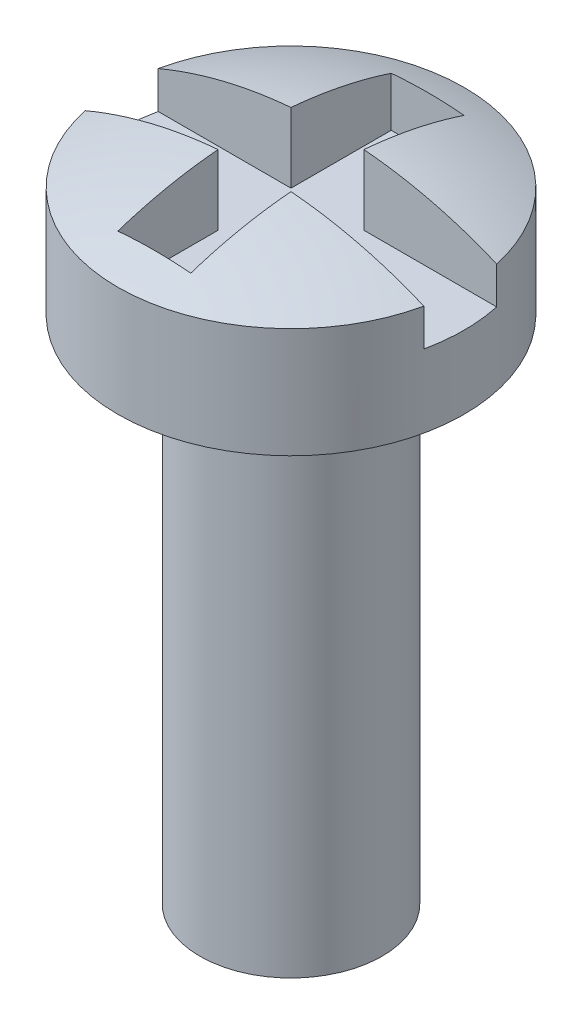
ISO-10303-21;
HEADER;
FILE_DESCRIPTION(('STEP AP214'),'2;1');
FILE_NAME('part.step','',(''),(''),'','','');
FILE_SCHEMA(('AUTOMOTIVE_DESIGN { 1 0 10303 214 1 1 1 1 }'));
ENDSEC;
DATA;
#1=APPLICATION_CONTEXT('core data for automotive mechanical design processes');
#2=APPLICATION_PROTOCOL_DEFINITION('international standard','automotive_design',2000,#1);
#3=PRODUCT_CONTEXT('',#1,'mechanical');
#4=PRODUCT('Part','Part','',(#3));
#5=PRODUCT_RELATED_PRODUCT_CATEGORY('part','',(#4));
#6=PRODUCT_DEFINITION_FORMATION('','',#4);
#7=PRODUCT_DEFINITION_CONTEXT('part definition',#1,'design');
#8=PRODUCT_DEFINITION('design','',#6,#7);
#9=PRODUCT_DEFINITION_SHAPE('','',#8);
#10=(LENGTH_UNIT() NAMED_UNIT(*) SI_UNIT(.MILLI.,.METRE.));
#11=(NAMED_UNIT(*) PLANE_ANGLE_UNIT() SI_UNIT($,.RADIAN.));
#12=(NAMED_UNIT(*) SI_UNIT($,.STERADIAN.) SOLID_ANGLE_UNIT());
#13=UNCERTAINTY_MEASURE_WITH_UNIT(LENGTH_MEASURE(1.E-05),#10,'distance_accuracy_value','');
#14=(GEOMETRIC_REPRESENTATION_CONTEXT(3) GLOBAL_UNCERTAINTY_ASSIGNED_CONTEXT((#13)) GLOBAL_UNIT_ASSIGNED_CONTEXT((#10,
#11,#12)) REPRESENTATION_CONTEXT('',''));
#15=CARTESIAN_POINT('',(0.,0.,0.));
#16=DIRECTION('',(0.,0.,1.));
#17=DIRECTION('',(1.,0.,0.));
#18=AXIS2_PLACEMENT_3D('',#15,#16,#17);
#19=CARTESIAN_POINT('',(-3.50234861591695,8.,-0.5));
#20=DIRECTION('',(0.,0.,-1.));
#21=DIRECTION('',(-1.,0.,0.));
#22=AXIS2_PLACEMENT_3D('',#19,#20,#21);
#23=PLANE('',#22);
#24=CARTESIAN_POINT('',(0.,3.,-0.5));
#25=DIRECTION('',(0.,0.,-1.));
#26=DIRECTION('',(-1.,0.,0.));
#27=AXIS2_PLACEMENT_3D('',#24,#25,#26);
#28=CIRCLE('',#27,5.9791303715507);
#29=CARTESIAN_POINT('',(-2.32177195262584,8.50993421013355,-0.5));
#30=VERTEX_POINT('',#29);
#31=CARTESIAN_POINT('',(-0.5,8.95818764390649,-0.5));
#32=VERTEX_POINT('',#31);
#33=EDGE_CURVE('E218',#30,#32,#28,.T.);
#34=ORIENTED_EDGE('',*,*,#33,.F.);
#35=DIRECTION('',(0.,-1.,0.));
#36=VECTOR('',#35,1.);
#37=CARTESIAN_POINT('',(-2.32177195262584,9.,-0.5));
#38=LINE('',#37,#36);
#39=CARTESIAN_POINT('',(-2.32177195262584,8.,-0.5));
#40=VERTEX_POINT('',#39);
#41=EDGE_CURVE('E161',#40,#30,#38,.F.);
#42=ORIENTED_EDGE('',*,*,#41,.F.);
#43=DIRECTION('',(-1.,0.,0.));
#44=VECTOR('',#43,1.);
#45=CARTESIAN_POINT('',(-3.50234861591695,8.,-0.5));
#46=LINE('',#45,#44);
#47=CARTESIAN_POINT('',(-0.5,8.,-0.5));
#48=VERTEX_POINT('',#47);
#49=EDGE_CURVE('E152',#48,#40,#46,.T.);
#50=ORIENTED_EDGE('',*,*,#49,.F.);
#51=DIRECTION('',(0.,1.,0.));
#52=VECTOR('',#51,1.);
#53=CARTESIAN_POINT('',(-0.5,8.,-0.5));
#54=LINE('',#53,#52);
#55=EDGE_CURVE('E145',#48,#32,#54,.T.);
#56=ORIENTED_EDGE('',*,*,#55,.T.);
#57=EDGE_LOOP('',(#34,#42,#50,#56));
#58=FACE_BOUND('',#57,.T.);
#59=ADVANCED_FACE('F29',(#58),#23,.F.);
#60=CARTESIAN_POINT('',(-3.50234861591695,8.,0.5));
#61=DIRECTION('',(0.,0.,1.));
#62=DIRECTION('',(1.,0.,0.));
#63=AXIS2_PLACEMENT_3D('',#60,#61,#62);
#64=PLANE('',#63);
#65=CARTESIAN_POINT('',(0.,3.,0.5));
#66=DIRECTION('',(0.,0.,1.));
#67=DIRECTION('',(1.,0.,0.));
#68=AXIS2_PLACEMENT_3D('',#65,#66,#67);
#69=CIRCLE('',#68,5.9791303715507);
#70=CARTESIAN_POINT('',(-0.499999999999999,8.95818764390649,0.5));
#71=VERTEX_POINT('',#70);
#72=CARTESIAN_POINT('',(-2.32177195262584,8.50993421013355,0.5));
#73=VERTEX_POINT('',#72);
#74=EDGE_CURVE('E188',#71,#73,#69,.T.);
#75=ORIENTED_EDGE('',*,*,#74,.F.);
#76=DIRECTION('',(0.,-1.,0.));
#77=VECTOR('',#76,1.);
#78=CARTESIAN_POINT('',(-0.5,8.,0.5));
#79=LINE('',#78,#77);
#80=CARTESIAN_POINT('',(-0.499999999999999,8.,0.5));
#81=VERTEX_POINT('',#80);
#82=EDGE_CURVE('E37',#71,#81,#79,.T.);
#83=ORIENTED_EDGE('',*,*,#82,.T.);
#84=DIRECTION('',(1.,0.,0.));
#85=VECTOR('',#84,1.);
#86=CARTESIAN_POINT('',(-3.50234861591695,8.,0.5));
#87=LINE('',#86,#85);
#88=CARTESIAN_POINT('',(-2.32177195262584,8.,0.5));
#89=VERTEX_POINT('',#88);
#90=EDGE_CURVE('E149',#89,#81,#87,.T.);
#91=ORIENTED_EDGE('',*,*,#90,.F.);
#92=DIRECTION('',(0.,-1.,0.));
#93=VECTOR('',#92,1.);
#94=CARTESIAN_POINT('',(-2.32177195262584,9.,0.5));
#95=LINE('',#94,#93);
#96=EDGE_CURVE('E159',#73,#89,#95,.T.);
#97=ORIENTED_EDGE('',*,*,#96,.F.);
#98=EDGE_LOOP('',(#75,#83,#91,#97));
#99=FACE_BOUND('',#98,.T.);
#100=ADVANCED_FACE('F186',(#99),#64,.F.);
#101=CARTESIAN_POINT('',(0.,9.,0.));
#102=DIRECTION('',(0.,-1.,0.));
#103=DIRECTION('',(0.,0.,-1.));
#104=AXIS2_PLACEMENT_3D('',#101,#102,#103);
#105=CYLINDRICAL_SURFACE('',#104,2.375);
#106=CARTESIAN_POINT('',(0.,7.,0.));
#107=DIRECTION('',(0.,1.,0.));
#108=DIRECTION('',(0.,0.,1.));
#109=AXIS2_PLACEMENT_3D('',#106,#107,#108);
#110=CIRCLE('',#109,2.375);
#111=CARTESIAN_POINT('',(0.,7.,2.375));
#112=VERTEX_POINT('',#111);
#113=EDGE_CURVE('E166',#112,#112,#110,.T.);
#114=ORIENTED_EDGE('',*,*,#113,.T.);
#115=EDGE_LOOP('',(#114));
#116=FACE_BOUND('',#115,.T.);
#117=CARTESIAN_POINT('',(0.,8.50993421013355,0.));
#118=DIRECTION('',(0.,-1.,0.));
#119=DIRECTION('',(0.,0.,-1.));
#120=AXIS2_PLACEMENT_3D('',#117,#118,#119);
#121=CIRCLE('',#120,2.375);
#122=CARTESIAN_POINT('',(2.32177195262584,8.50993421013355,0.5));
#123=VERTEX_POINT('',#122);
#124=EDGE_CURVE('E207',#73,#123,#121,.F.);
#125=ORIENTED_EDGE('',*,*,#124,.F.);
#126=ORIENTED_EDGE('',*,*,#96,.T.);
#127=CARTESIAN_POINT('',(0.,8.,0.));
#128=DIRECTION('',(0.,1.,0.));
#129=DIRECTION('',(0.,0.,1.));
#130=AXIS2_PLACEMENT_3D('',#127,#128,#129);
#131=CIRCLE('',#130,2.375);
#132=EDGE_CURVE('E175',#40,#89,#131,.T.);
#133=ORIENTED_EDGE('',*,*,#132,.F.);
#134=ORIENTED_EDGE('',*,*,#41,.T.);
#135=CARTESIAN_POINT('',(2.32177195262584,8.50993421013355,-0.5));
#136=VERTEX_POINT('',#135);
#137=EDGE_CURVE('E213',#136,#30,#121,.F.);
#138=ORIENTED_EDGE('',*,*,#137,.F.);
#139=DIRECTION('',(0.,-1.,0.));
#140=VECTOR('',#139,1.);
#141=CARTESIAN_POINT('',(2.32177195262584,9.,-0.5));
#142=LINE('',#141,#140);
#143=CARTESIAN_POINT('',(2.32177195262584,8.,-0.5));
#144=VERTEX_POINT('',#143);
#145=EDGE_CURVE('E164',#136,#144,#142,.T.);
#146=ORIENTED_EDGE('',*,*,#145,.T.);
#147=CARTESIAN_POINT('',(2.32177195262584,8.,0.5));
#148=VERTEX_POINT('',#147);
#149=EDGE_CURVE('E178',#148,#144,#131,.T.);
#150=ORIENTED_EDGE('',*,*,#149,.F.);
#151=DIRECTION('',(0.,-1.,0.));
#152=VECTOR('',#151,1.);
#153=CARTESIAN_POINT('',(2.32177195262584,9.,0.5));
#154=LINE('',#153,#152);
#155=EDGE_CURVE('E156',#148,#123,#154,.F.);
#156=ORIENTED_EDGE('',*,*,#155,.T.);
#157=EDGE_LOOP('',(#125,#126,#133,#134,#138,#146,#150,#156));
#158=FACE_BOUND('',#157,.T.);
#159=ADVANCED_FACE('F205',(#116,#158),#105,.T.);
#160=CARTESIAN_POINT('',(0.,3.,-0.5));
#161=DIRECTION('',(0.,0.,-1.));
#162=DIRECTION('',(-1.,0.,0.));
#163=AXIS2_PLACEMENT_3D('',#160,#161,#162);
#164=CIRCLE('',#163,5.9791303715507);
#165=CARTESIAN_POINT('',(0.5,8.95818764390649,-0.5));
#166=VERTEX_POINT('',#165);
#167=EDGE_CURVE('E219',#166,#136,#164,.T.);
#168=ORIENTED_EDGE('',*,*,#167,.F.);
#169=DIRECTION('',(0.,-1.,0.));
#170=VECTOR('',#169,1.);
#171=CARTESIAN_POINT('',(0.5,8.,-0.5));
#172=LINE('',#171,#170);
#173=CARTESIAN_POINT('',(0.5,8.,-0.5));
#174=VERTEX_POINT('',#173);
#175=EDGE_CURVE('E128',#166,#174,#172,.T.);
#176=ORIENTED_EDGE('',*,*,#175,.T.);
#177=EDGE_CURVE('E153',#144,#174,#46,.T.);
#178=ORIENTED_EDGE('',*,*,#177,.F.);
#179=ORIENTED_EDGE('',*,*,#145,.F.);
#180=EDGE_LOOP('',(#168,#176,#178,#179));
#181=FACE_BOUND('',#180,.T.);
#182=ADVANCED_FACE('F227',(#181),#23,.F.);
#183=CARTESIAN_POINT('',(0.,3.,0.5));
#184=DIRECTION('',(0.,0.,1.));
#185=DIRECTION('',(1.,0.,0.));
#186=AXIS2_PLACEMENT_3D('',#183,#184,#185);
#187=CIRCLE('',#186,5.9791303715507);
#188=CARTESIAN_POINT('',(0.5,8.95818764390649,0.5));
#189=VERTEX_POINT('',#188);
#190=EDGE_CURVE('E211',#123,#189,#187,.T.);
#191=ORIENTED_EDGE('',*,*,#190,.F.);
#192=ORIENTED_EDGE('',*,*,#155,.F.);
#193=CARTESIAN_POINT('',(0.5,8.,0.5));
#194=VERTEX_POINT('',#193);
#195=EDGE_CURVE('E148',#194,#148,#87,.T.);
#196=ORIENTED_EDGE('',*,*,#195,.F.);
#197=DIRECTION('',(0.,1.,0.));
#198=VECTOR('',#197,1.);
#199=CARTESIAN_POINT('',(0.5,8.,0.5));
#200=LINE('',#199,#198);
#201=EDGE_CURVE('E179',#194,#189,#200,.T.);
#202=ORIENTED_EDGE('',*,*,#201,.T.);
#203=EDGE_LOOP('',(#191,#192,#196,#202));
#204=FACE_BOUND('',#203,.T.);
#205=ADVANCED_FACE('F234',(#204),#64,.F.);
#206=CARTESIAN_POINT('',(0.5,8.,-1.875));
#207=DIRECTION('',(1.,0.,0.));
#208=DIRECTION('',(0.,0.,-1.));
#209=AXIS2_PLACEMENT_3D('',#206,#207,#208);
#210=PLANE('',#209);
#211=CARTESIAN_POINT('',(0.5,3.,0.));
#212=DIRECTION('',(1.,0.,0.));
#213=DIRECTION('',(0.,0.,-1.));
#214=AXIS2_PLACEMENT_3D('',#211,#212,#213);
#215=CIRCLE('',#214,5.9791303715507);
#216=CARTESIAN_POINT('',(0.499999999999999,8.67753247458788,1.875));
#217=VERTEX_POINT('',#216);
#218=EDGE_CURVE('E44',#189,#217,#215,.T.);
#219=ORIENTED_EDGE('',*,*,#218,.F.);
#220=ORIENTED_EDGE('',*,*,#201,.F.);
#221=DIRECTION('',(0.,0.,-1.));
#222=VECTOR('',#221,1.);
#223=CARTESIAN_POINT('',(0.5,8.,-1.875));
#224=LINE('',#223,#222);
#225=CARTESIAN_POINT('',(0.499999999999999,8.,1.875));
#226=VERTEX_POINT('',#225);
#227=EDGE_CURVE('E231',#226,#194,#224,.T.);
#228=ORIENTED_EDGE('',*,*,#227,.F.);
#229=DIRECTION('',(0.,1.,0.));
#230=VECTOR('',#229,1.);
#231=CARTESIAN_POINT('',(0.499999999999999,8.,1.875));
#232=LINE('',#231,#230);
#233=EDGE_CURVE('E134',#226,#217,#232,.T.);
#234=ORIENTED_EDGE('',*,*,#233,.T.);
#235=EDGE_LOOP('',(#219,#220,#228,#234));
#236=FACE_BOUND('',#235,.T.);
#237=ADVANCED_FACE('F237',(#236),#210,.F.);
#238=CARTESIAN_POINT('',(-0.5,8.,-1.875));
#239=DIRECTION('',(-1.,0.,0.));
#240=DIRECTION('',(0.,0.,1.));
#241=AXIS2_PLACEMENT_3D('',#238,#239,#240);
#242=PLANE('',#241);
#243=CARTESIAN_POINT('',(-0.5,3.,0.));
#244=DIRECTION('',(-1.,0.,0.));
#245=DIRECTION('',(0.,0.,1.));
#246=AXIS2_PLACEMENT_3D('',#243,#244,#245);
#247=CIRCLE('',#246,5.9791303715507);
#248=CARTESIAN_POINT('',(-0.499999999999999,8.67753247458788,1.875));
#249=VERTEX_POINT('',#248);
#250=EDGE_CURVE('E238',#249,#71,#247,.T.);
#251=ORIENTED_EDGE('',*,*,#250,.F.);
#252=DIRECTION('',(0.,1.,0.));
#253=VECTOR('',#252,1.);
#254=CARTESIAN_POINT('',(-0.499999999999999,8.,1.875));
#255=LINE('',#254,#253);
#256=CARTESIAN_POINT('',(-0.499999999999999,8.,1.875));
#257=VERTEX_POINT('',#256);
#258=EDGE_CURVE('E138',#257,#249,#255,.T.);
#259=ORIENTED_EDGE('',*,*,#258,.F.);
#260=DIRECTION('',(0.,0.,1.));
#261=VECTOR('',#260,1.);
#262=CARTESIAN_POINT('',(-0.5,8.,-1.875));
#263=LINE('',#262,#261);
#264=EDGE_CURVE('E192',#81,#257,#263,.T.);
#265=ORIENTED_EDGE('',*,*,#264,.F.);
#266=ORIENTED_EDGE('',*,*,#82,.F.);
#267=EDGE_LOOP('',(#251,#259,#265,#266));
#268=FACE_BOUND('',#267,.T.);
#269=ADVANCED_FACE('F193',(#268),#242,.F.);
#270=CARTESIAN_POINT('',(-0.499999999999999,8.,1.875));
#271=DIRECTION('',(0.,0.,1.));
#272=DIRECTION('',(1.,0.,0.));
#273=AXIS2_PLACEMENT_3D('',#270,#271,#272);
#274=PLANE('',#273);
#275=CARTESIAN_POINT('',(0.,3.,1.875));
#276=DIRECTION('',(0.,0.,1.));
#277=DIRECTION('',(1.,0.,0.));
#278=AXIS2_PLACEMENT_3D('',#275,#276,#277);
#279=CIRCLE('',#278,5.699506557589);
#280=EDGE_CURVE('E221',#217,#249,#279,.T.);
#281=ORIENTED_EDGE('',*,*,#280,.F.);
#282=ORIENTED_EDGE('',*,*,#233,.F.);
#283=DIRECTION('',(1.,0.,0.));
#284=VECTOR('',#283,1.);
#285=CARTESIAN_POINT('',(-0.499999999999999,8.,1.875));
#286=LINE('',#285,#284);
#287=EDGE_CURVE('E243',#257,#226,#286,.T.);
#288=ORIENTED_EDGE('',*,*,#287,.F.);
#289=ORIENTED_EDGE('',*,*,#258,.T.);
#290=EDGE_LOOP('',(#281,#282,#288,#289));
#291=FACE_BOUND('',#290,.T.);
#292=ADVANCED_FACE('F294',(#291),#274,.F.);
#293=CARTESIAN_POINT('',(-0.5,3.,0.));
#294=DIRECTION('',(-1.,0.,0.));
#295=DIRECTION('',(0.,0.,1.));
#296=AXIS2_PLACEMENT_3D('',#293,#294,#295);
#297=CIRCLE('',#296,5.9791303715507);
#298=CARTESIAN_POINT('',(-0.5,8.67753247458788,-1.875));
#299=VERTEX_POINT('',#298);
#300=EDGE_CURVE('E51',#32,#299,#297,.T.);
#301=ORIENTED_EDGE('',*,*,#300,.F.);
#302=ORIENTED_EDGE('',*,*,#55,.F.);
#303=CARTESIAN_POINT('',(-0.5,8.,-1.875));
#304=VERTEX_POINT('',#303);
#305=EDGE_CURVE('E197',#304,#48,#263,.T.);
#306=ORIENTED_EDGE('',*,*,#305,.F.);
#307=DIRECTION('',(0.,1.,0.));
#308=VECTOR('',#307,1.);
#309=CARTESIAN_POINT('',(-0.5,8.,-1.875));
#310=LINE('',#309,#308);
#311=EDGE_CURVE('E133',#304,#299,#310,.T.);
#312=ORIENTED_EDGE('',*,*,#311,.T.);
#313=EDGE_LOOP('',(#301,#302,#306,#312));
#314=FACE_BOUND('',#313,.T.);
#315=ADVANCED_FACE('F248',(#314),#242,.F.);
#316=CARTESIAN_POINT('',(0.5,3.,0.));
#317=DIRECTION('',(1.,0.,0.));
#318=DIRECTION('',(0.,0.,-1.));
#319=AXIS2_PLACEMENT_3D('',#316,#317,#318);
#320=CIRCLE('',#319,5.9791303715507);
#321=CARTESIAN_POINT('',(0.5,8.67753247458788,-1.875));
#322=VERTEX_POINT('',#321);
#323=EDGE_CURVE('E116',#322,#166,#320,.T.);
#324=ORIENTED_EDGE('',*,*,#323,.F.);
#325=DIRECTION('',(0.,1.,0.));
#326=VECTOR('',#325,1.);
#327=CARTESIAN_POINT('',(0.5,8.,-1.875));
#328=LINE('',#327,#326);
#329=CARTESIAN_POINT('',(0.5,8.,-1.875));
#330=VERTEX_POINT('',#329);
#331=EDGE_CURVE('E126',#330,#322,#328,.T.);
#332=ORIENTED_EDGE('',*,*,#331,.F.);
#333=EDGE_CURVE('E228',#174,#330,#224,.T.);
#334=ORIENTED_EDGE('',*,*,#333,.F.);
#335=ORIENTED_EDGE('',*,*,#175,.F.);
#336=EDGE_LOOP('',(#324,#332,#334,#335));
#337=FACE_BOUND('',#336,.T.);
#338=ADVANCED_FACE('F124',(#337),#210,.F.);
#339=CARTESIAN_POINT('',(-0.5,8.,-1.875));
#340=DIRECTION('',(0.,0.,-1.));
#341=DIRECTION('',(-1.,0.,0.));
#342=AXIS2_PLACEMENT_3D('',#339,#340,#341);
#343=PLANE('',#342);
#344=CARTESIAN_POINT('',(0.,3.,-1.875));
#345=DIRECTION('',(0.,0.,-1.));
#346=DIRECTION('',(-1.,0.,0.));
#347=AXIS2_PLACEMENT_3D('',#344,#345,#346);
#348=CIRCLE('',#347,5.699506557589);
#349=EDGE_CURVE('E11',#299,#322,#348,.T.);
#350=ORIENTED_EDGE('',*,*,#349,.F.);
#351=ORIENTED_EDGE('',*,*,#311,.F.);
#352=DIRECTION('',(-1.,0.,0.));
#353=VECTOR('',#352,1.);
#354=CARTESIAN_POINT('',(-0.5,8.,-1.875));
#355=LINE('',#354,#353);
#356=EDGE_CURVE('E132',#330,#304,#355,.T.);
#357=ORIENTED_EDGE('',*,*,#356,.F.);
#358=ORIENTED_EDGE('',*,*,#331,.T.);
#359=EDGE_LOOP('',(#350,#351,#357,#358));
#360=FACE_BOUND('',#359,.T.);
#361=ADVANCED_FACE('F130',(#360),#343,.F.);
#362=CARTESIAN_POINT('',(0.,7.,0.));
#363=DIRECTION('',(0.,-1.,0.));
#364=DIRECTION('',(0.,0.,-1.));
#365=AXIS2_PLACEMENT_3D('',#362,#363,#364);
#366=CYLINDRICAL_SURFACE('',#365,1.25);
#367=CARTESIAN_POINT('',(0.,7.,0.));
#368=DIRECTION('',(0.,1.,0.));
#369=DIRECTION('',(0.,0.,1.));
#370=AXIS2_PLACEMENT_3D('',#367,#368,#369);
#371=CIRCLE('',#370,1.25);
#372=CARTESIAN_POINT('',(0.,7.,1.25));
#373=VERTEX_POINT('',#372);
#374=EDGE_CURVE('E172',#373,#373,#371,.T.);
#375=ORIENTED_EDGE('',*,*,#374,.F.);
#376=EDGE_LOOP('',(#375));
#377=FACE_BOUND('',#376,.T.);
#378=CARTESIAN_POINT('',(0.,0.,0.));
#379=DIRECTION('',(0.,1.,0.));
#380=DIRECTION('',(0.,0.,1.));
#381=AXIS2_PLACEMENT_3D('',#378,#379,#380);
#382=CIRCLE('',#381,1.25);
#383=CARTESIAN_POINT('',(0.,0.,1.25));
#384=VERTEX_POINT('',#383);
#385=EDGE_CURVE('E169',#384,#384,#382,.T.);
#386=ORIENTED_EDGE('',*,*,#385,.T.);
#387=EDGE_LOOP('',(#386));
#388=FACE_BOUND('',#387,.T.);
#389=ADVANCED_FACE('F31',(#377,#388),#366,.T.);
#390=CARTESIAN_POINT('',(0.,0.,0.));
#391=DIRECTION('',(0.,1.,0.));
#392=DIRECTION('',(0.,0.,1.));
#393=AXIS2_PLACEMENT_3D('',#390,#391,#392);
#394=PLANE('',#393);
#395=ORIENTED_EDGE('',*,*,#385,.F.);
#396=EDGE_LOOP('',(#395));
#397=FACE_BOUND('',#396,.T.);
#398=ADVANCED_FACE('F269',(#397),#394,.F.);
#399=CARTESIAN_POINT('',(0.,7.,0.));
#400=DIRECTION('',(0.,1.,0.));
#401=DIRECTION('',(0.,0.,1.));
#402=AXIS2_PLACEMENT_3D('',#399,#400,#401);
#403=PLANE('',#402);
#404=ORIENTED_EDGE('',*,*,#113,.F.);
#405=EDGE_LOOP('',(#404));
#406=FACE_BOUND('',#405,.T.);
#407=ORIENTED_EDGE('',*,*,#374,.T.);
#408=EDGE_LOOP('',(#407));
#409=FACE_BOUND('',#408,.T.);
#410=ADVANCED_FACE('F268',(#406,#409),#403,.F.);
#411=CARTESIAN_POINT('',(-3.50234861591695,8.,0.5));
#412=DIRECTION('',(0.,1.,0.));
#413=DIRECTION('',(0.,0.,1.));
#414=AXIS2_PLACEMENT_3D('',#411,#412,#413);
#415=PLANE('',#414);
#416=ORIENTED_EDGE('',*,*,#177,.T.);
#417=ORIENTED_EDGE('',*,*,#333,.T.);
#418=ORIENTED_EDGE('',*,*,#356,.T.);
#419=ORIENTED_EDGE('',*,*,#305,.T.);
#420=ORIENTED_EDGE('',*,*,#49,.T.);
#421=ORIENTED_EDGE('',*,*,#132,.T.);
#422=ORIENTED_EDGE('',*,*,#90,.T.);
#423=ORIENTED_EDGE('',*,*,#264,.T.);
#424=ORIENTED_EDGE('',*,*,#287,.T.);
#425=ORIENTED_EDGE('',*,*,#227,.T.);
#426=ORIENTED_EDGE('',*,*,#195,.T.);
#427=ORIENTED_EDGE('',*,*,#149,.T.);
#428=EDGE_LOOP('',(#416,#417,#418,#419,#420,#421,#422,#423,#424,#425,#426,#427));
#429=FACE_BOUND('',#428,.T.);
#430=ADVANCED_FACE('F199',(#429),#415,.T.);
#431=CARTESIAN_POINT('',(0.,3.,0.));
#432=DIRECTION('',(0.,-1.,0.));
#433=DIRECTION('',(0.,0.,1.));
#434=AXIS2_PLACEMENT_3D('',#431,#432,#433);
#435=SPHERICAL_SURFACE('',#434,6.);
#436=ORIENTED_EDGE('',*,*,#33,.T.);
#437=ORIENTED_EDGE('',*,*,#300,.T.);
#438=ORIENTED_EDGE('',*,*,#349,.T.);
#439=ORIENTED_EDGE('',*,*,#323,.T.);
#440=ORIENTED_EDGE('',*,*,#167,.T.);
#441=ORIENTED_EDGE('',*,*,#137,.T.);
#442=EDGE_LOOP('',(#436,#437,#438,#439,#440,#441));
#443=FACE_BOUND('',#442,.T.);
#444=ADVANCED_FACE('F115',(#443),#435,.T.);
#445=ORIENTED_EDGE('',*,*,#74,.T.);
#446=ORIENTED_EDGE('',*,*,#124,.T.);
#447=ORIENTED_EDGE('',*,*,#190,.T.);
#448=ORIENTED_EDGE('',*,*,#218,.T.);
#449=ORIENTED_EDGE('',*,*,#280,.T.);
#450=ORIENTED_EDGE('',*,*,#250,.T.);
#451=EDGE_LOOP('',(#445,#446,#447,#448,#449,#450));
#452=FACE_BOUND('',#451,.T.);
#453=ADVANCED_FACE('F235',(#452),#435,.T.);
#454=CLOSED_SHELL('',(#59,#100,#159,#182,#205,#237,#269,#292,#315,#338,#361,#389,#398,#410,#430,
#444,#453));
#455=MANIFOLD_SOLID_BREP('B2',#454);
#456=ADVANCED_BREP_SHAPE_REPRESENTATION('',(#18,#455),#14);
#457=SHAPE_DEFINITION_REPRESENTATION(#9,#456);
ENDSEC;
END-ISO-10303-21;
